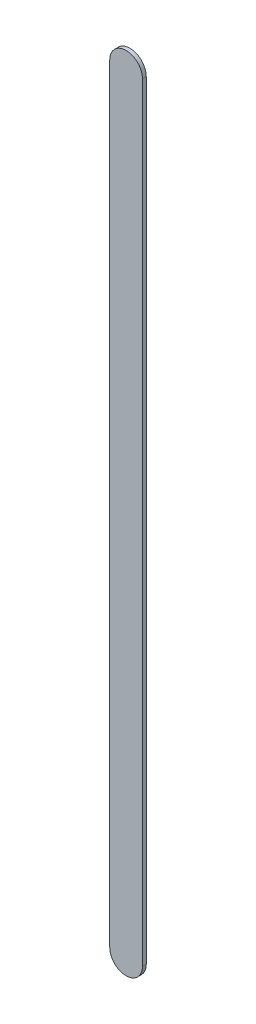
ISO-10303-21;
HEADER;
FILE_DESCRIPTION(('STEP AP214'),'2;1');
FILE_NAME('part.step','',(''),(''),'','','');
FILE_SCHEMA(('AUTOMOTIVE_DESIGN { 1 0 10303 214 1 1 1 1 }'));
ENDSEC;
DATA;
#1=APPLICATION_CONTEXT('core data for automotive mechanical design processes');
#2=APPLICATION_PROTOCOL_DEFINITION('international standard','automotive_design',2000,#1);
#3=PRODUCT_CONTEXT('',#1,'mechanical');
#4=PRODUCT('Part','Part','',(#3));
#5=PRODUCT_RELATED_PRODUCT_CATEGORY('part','',(#4));
#6=PRODUCT_DEFINITION_FORMATION('','',#4);
#7=PRODUCT_DEFINITION_CONTEXT('part definition',#1,'design');
#8=PRODUCT_DEFINITION('design','',#6,#7);
#9=PRODUCT_DEFINITION_SHAPE('','',#8);
#10=(LENGTH_UNIT() NAMED_UNIT(*) SI_UNIT(.MILLI.,.METRE.));
#11=(NAMED_UNIT(*) PLANE_ANGLE_UNIT() SI_UNIT($,.RADIAN.));
#12=(NAMED_UNIT(*) SI_UNIT($,.STERADIAN.) SOLID_ANGLE_UNIT());
#13=UNCERTAINTY_MEASURE_WITH_UNIT(LENGTH_MEASURE(1.E-05),#10,'distance_accuracy_value','');
#14=(GEOMETRIC_REPRESENTATION_CONTEXT(3) GLOBAL_UNCERTAINTY_ASSIGNED_CONTEXT((#13)) GLOBAL_UNIT_ASSIGNED_CONTEXT((#10,
#11,#12)) REPRESENTATION_CONTEXT('',''));
#15=CARTESIAN_POINT('',(0.,0.,0.));
#16=DIRECTION('',(0.,0.,1.));
#17=DIRECTION('',(1.,0.,0.));
#18=AXIS2_PLACEMENT_3D('',#15,#16,#17);
#19=CARTESIAN_POINT('',(121.11,-77.82,1.635));
#20=DIRECTION('',(0.,0.,1.));
#21=DIRECTION('',(1.,0.,0.));
#22=AXIS2_PLACEMENT_3D('',#19,#20,#21);
#23=PLANE('',#22);
#24=DIRECTION('',(0.,-1.,0.));
#25=VECTOR('',#24,1.);
#26=CARTESIAN_POINT('',(121.11,-77.82,1.635));
#27=LINE('',#26,#25);
#28=CARTESIAN_POINT('',(121.11,-77.82,1.635));
#29=VERTEX_POINT('',#28);
#30=CARTESIAN_POINT('',(121.11,-84.87,1.635));
#31=VERTEX_POINT('',#30);
#32=EDGE_CURVE('E82',#29,#31,#27,.T.);
#33=ORIENTED_EDGE('',*,*,#32,.T.);
#34=CARTESIAN_POINT('',(121.26,-84.87,1.635));
#35=DIRECTION('',(0.,0.,1.));
#36=DIRECTION('',(-1.,0.,0.));
#37=AXIS2_PLACEMENT_3D('',#34,#35,#36);
#38=CIRCLE('',#37,0.15);
#39=CARTESIAN_POINT('',(121.41,-84.87,1.635));
#40=VERTEX_POINT('',#39);
#41=EDGE_CURVE('E108',#31,#40,#38,.T.);
#42=ORIENTED_EDGE('',*,*,#41,.T.);
#43=DIRECTION('',(0.,1.,0.));
#44=VECTOR('',#43,1.);
#45=CARTESIAN_POINT('',(121.41,-84.87,1.635));
#46=LINE('',#45,#44);
#47=CARTESIAN_POINT('',(121.41,-77.82,1.635));
#48=VERTEX_POINT('',#47);
#49=EDGE_CURVE('E75',#40,#48,#46,.T.);
#50=ORIENTED_EDGE('',*,*,#49,.T.);
#51=CARTESIAN_POINT('',(121.26,-77.82,1.635));
#52=DIRECTION('',(0.,0.,1.));
#53=DIRECTION('',(1.,0.,0.));
#54=AXIS2_PLACEMENT_3D('',#51,#52,#53);
#55=CIRCLE('',#54,0.15);
#56=EDGE_CURVE('E11',#48,#29,#55,.T.);
#57=ORIENTED_EDGE('',*,*,#56,.T.);
#58=EDGE_LOOP('',(#33,#42,#50,#57));
#59=FACE_BOUND('',#58,.T.);
#60=ADVANCED_FACE('F17',(#59),#23,.T.);
#61=CARTESIAN_POINT('',(121.11,-77.82,1.6));
#62=DIRECTION('',(0.,0.,1.));
#63=DIRECTION('',(1.,0.,0.));
#64=AXIS2_PLACEMENT_3D('',#61,#62,#63);
#65=PLANE('',#64);
#66=CARTESIAN_POINT('',(121.26,-77.82,1.6));
#67=DIRECTION('',(0.,0.,1.));
#68=DIRECTION('',(1.,0.,0.));
#69=AXIS2_PLACEMENT_3D('',#66,#67,#68);
#70=CIRCLE('',#69,0.15);
#71=CARTESIAN_POINT('',(121.41,-77.82,1.6));
#72=VERTEX_POINT('',#71);
#73=CARTESIAN_POINT('',(121.11,-77.82,1.6));
#74=VERTEX_POINT('',#73);
#75=EDGE_CURVE('E20',#72,#74,#70,.T.);
#76=ORIENTED_EDGE('',*,*,#75,.F.);
#77=DIRECTION('',(0.,1.,0.));
#78=VECTOR('',#77,1.);
#79=CARTESIAN_POINT('',(121.41,-84.87,1.6));
#80=LINE('',#79,#78);
#81=CARTESIAN_POINT('',(121.41,-84.87,1.6));
#82=VERTEX_POINT('',#81);
#83=EDGE_CURVE('E112',#82,#72,#80,.T.);
#84=ORIENTED_EDGE('',*,*,#83,.F.);
#85=CARTESIAN_POINT('',(121.26,-84.87,1.6));
#86=DIRECTION('',(0.,0.,1.));
#87=DIRECTION('',(-1.,0.,0.));
#88=AXIS2_PLACEMENT_3D('',#85,#86,#87);
#89=CIRCLE('',#88,0.15);
#90=CARTESIAN_POINT('',(121.11,-84.87,1.6));
#91=VERTEX_POINT('',#90);
#92=EDGE_CURVE('E84',#91,#82,#89,.T.);
#93=ORIENTED_EDGE('',*,*,#92,.F.);
#94=DIRECTION('',(0.,-1.,0.));
#95=VECTOR('',#94,1.);
#96=CARTESIAN_POINT('',(121.11,-77.82,1.6));
#97=LINE('',#96,#95);
#98=EDGE_CURVE('E80',#74,#91,#97,.T.);
#99=ORIENTED_EDGE('',*,*,#98,.F.);
#100=EDGE_LOOP('',(#76,#84,#93,#99));
#101=FACE_BOUND('',#100,.T.);
#102=ADVANCED_FACE('F86',(#101),#65,.F.);
#103=CARTESIAN_POINT('',(121.26,-77.82,1.6));
#104=DIRECTION('',(0.,0.,-1.));
#105=DIRECTION('',(1.,0.,0.));
#106=AXIS2_PLACEMENT_3D('',#103,#104,#105);
#107=CYLINDRICAL_SURFACE('',#106,0.15);
#108=ORIENTED_EDGE('',*,*,#75,.T.);
#109=DIRECTION('',(0.,0.,1.));
#110=VECTOR('',#109,1.);
#111=CARTESIAN_POINT('',(121.11,-77.82,1.6));
#112=LINE('',#111,#110);
#113=EDGE_CURVE('E69',#74,#29,#112,.T.);
#114=ORIENTED_EDGE('',*,*,#113,.T.);
#115=ORIENTED_EDGE('',*,*,#56,.F.);
#116=DIRECTION('',(0.,0.,1.));
#117=VECTOR('',#116,1.);
#118=CARTESIAN_POINT('',(121.41,-77.82,1.6));
#119=LINE('',#118,#117);
#120=EDGE_CURVE('E72',#72,#48,#119,.T.);
#121=ORIENTED_EDGE('',*,*,#120,.F.);
#122=EDGE_LOOP('',(#108,#114,#115,#121));
#123=FACE_BOUND('',#122,.T.);
#124=ADVANCED_FACE('F68',(#123),#107,.T.);
#125=CARTESIAN_POINT('',(121.41,-84.87,1.6));
#126=DIRECTION('',(-1.,0.,0.));
#127=DIRECTION('',(0.,0.,1.));
#128=AXIS2_PLACEMENT_3D('',#125,#126,#127);
#129=PLANE('',#128);
#130=ORIENTED_EDGE('',*,*,#83,.T.);
#131=ORIENTED_EDGE('',*,*,#120,.T.);
#132=ORIENTED_EDGE('',*,*,#49,.F.);
#133=DIRECTION('',(0.,0.,1.));
#134=VECTOR('',#133,1.);
#135=CARTESIAN_POINT('',(121.41,-84.87,1.6));
#136=LINE('',#135,#134);
#137=EDGE_CURVE('E102',#82,#40,#136,.T.);
#138=ORIENTED_EDGE('',*,*,#137,.F.);
#139=EDGE_LOOP('',(#130,#131,#132,#138));
#140=FACE_BOUND('',#139,.T.);
#141=ADVANCED_FACE('F119',(#140),#129,.F.);
#142=CARTESIAN_POINT('',(121.26,-84.87,1.6));
#143=DIRECTION('',(0.,0.,-1.));
#144=DIRECTION('',(-1.,0.,0.));
#145=AXIS2_PLACEMENT_3D('',#142,#143,#144);
#146=CYLINDRICAL_SURFACE('',#145,0.15);
#147=ORIENTED_EDGE('',*,*,#92,.T.);
#148=ORIENTED_EDGE('',*,*,#137,.T.);
#149=ORIENTED_EDGE('',*,*,#41,.F.);
#150=DIRECTION('',(0.,0.,1.));
#151=VECTOR('',#150,1.);
#152=CARTESIAN_POINT('',(121.11,-84.87,1.6));
#153=LINE('',#152,#151);
#154=EDGE_CURVE('E90',#91,#31,#153,.T.);
#155=ORIENTED_EDGE('',*,*,#154,.F.);
#156=EDGE_LOOP('',(#147,#148,#149,#155));
#157=FACE_BOUND('',#156,.T.);
#158=ADVANCED_FACE('F121',(#157),#146,.T.);
#159=CARTESIAN_POINT('',(121.11,-77.82,1.6));
#160=DIRECTION('',(1.,0.,0.));
#161=DIRECTION('',(0.,1.,0.));
#162=AXIS2_PLACEMENT_3D('',#159,#160,#161);
#163=PLANE('',#162);
#164=ORIENTED_EDGE('',*,*,#98,.T.);
#165=ORIENTED_EDGE('',*,*,#154,.T.);
#166=ORIENTED_EDGE('',*,*,#32,.F.);
#167=ORIENTED_EDGE('',*,*,#113,.F.);
#168=EDGE_LOOP('',(#164,#165,#166,#167));
#169=FACE_BOUND('',#168,.T.);
#170=ADVANCED_FACE('F78',(#169),#163,.F.);
#171=CLOSED_SHELL('',(#60,#102,#124,#141,#158,#170));
#172=MANIFOLD_SOLID_BREP('B1',#171);
#173=ADVANCED_BREP_SHAPE_REPRESENTATION('',(#18,#172),#14);
#174=SHAPE_DEFINITION_REPRESENTATION(#9,#173);
ENDSEC;
END-ISO-10303-21;
